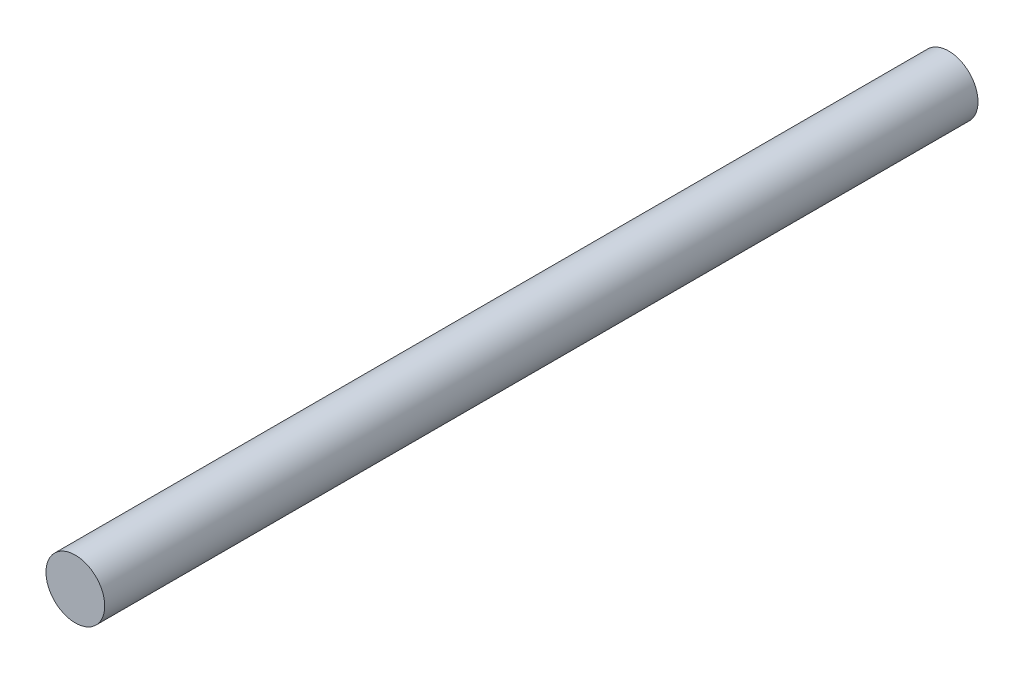
ISO-10303-21;
HEADER;
FILE_DESCRIPTION(('STEP AP214'),'2;1');
FILE_NAME('part.step','',(''),(''),'','','');
FILE_SCHEMA(('AUTOMOTIVE_DESIGN { 1 0 10303 214 1 1 1 1 }'));
ENDSEC;
DATA;
#1=APPLICATION_CONTEXT('core data for automotive mechanical design processes');
#2=APPLICATION_PROTOCOL_DEFINITION('international standard','automotive_design',2000,#1);
#3=PRODUCT_CONTEXT('',#1,'mechanical');
#4=PRODUCT('Part','Part','',(#3));
#5=PRODUCT_RELATED_PRODUCT_CATEGORY('part','',(#4));
#6=PRODUCT_DEFINITION_FORMATION('','',#4);
#7=PRODUCT_DEFINITION_CONTEXT('part definition',#1,'design');
#8=PRODUCT_DEFINITION('design','',#6,#7);
#9=PRODUCT_DEFINITION_SHAPE('','',#8);
#10=(LENGTH_UNIT() NAMED_UNIT(*) SI_UNIT(.MILLI.,.METRE.));
#11=(NAMED_UNIT(*) PLANE_ANGLE_UNIT() SI_UNIT($,.RADIAN.));
#12=(NAMED_UNIT(*) SI_UNIT($,.STERADIAN.) SOLID_ANGLE_UNIT());
#13=UNCERTAINTY_MEASURE_WITH_UNIT(LENGTH_MEASURE(1.E-05),#10,'distance_accuracy_value','');
#14=(GEOMETRIC_REPRESENTATION_CONTEXT(3) GLOBAL_UNCERTAINTY_ASSIGNED_CONTEXT((#13)) GLOBAL_UNIT_ASSIGNED_CONTEXT((#10,
#11,#12)) REPRESENTATION_CONTEXT('',''));
#15=CARTESIAN_POINT('',(0.,0.,0.));
#16=DIRECTION('',(0.,0.,1.));
#17=DIRECTION('',(1.,0.,0.));
#18=AXIS2_PLACEMENT_3D('',#15,#16,#17);
#19=CARTESIAN_POINT('',(0.,0.,74.25));
#20=DIRECTION('',(0.,0.,-1.));
#21=DIRECTION('',(-1.,0.,0.));
#22=AXIS2_PLACEMENT_3D('',#19,#20,#21);
#23=CYLINDRICAL_SURFACE('',#22,5.);
#24=CARTESIAN_POINT('',(0.,0.,74.25));
#25=DIRECTION('',(0.,0.,1.));
#26=DIRECTION('',(1.,0.,0.));
#27=AXIS2_PLACEMENT_3D('',#24,#25,#26);
#28=CIRCLE('',#27,5.);
#29=CARTESIAN_POINT('',(5.,0.,74.25));
#30=VERTEX_POINT('',#29);
#31=EDGE_CURVE('E10',#30,#30,#28,.T.);
#32=ORIENTED_EDGE('',*,*,#31,.F.);
#33=EDGE_LOOP('',(#32));
#34=FACE_BOUND('',#33,.T.);
#35=CARTESIAN_POINT('',(0.,0.,-74.25));
#36=DIRECTION('',(0.,0.,1.));
#37=DIRECTION('',(1.,0.,0.));
#38=AXIS2_PLACEMENT_3D('',#35,#36,#37);
#39=CIRCLE('',#38,5.);
#40=CARTESIAN_POINT('',(5.,0.,-74.25));
#41=VERTEX_POINT('',#40);
#42=EDGE_CURVE('E38',#41,#41,#39,.T.);
#43=ORIENTED_EDGE('',*,*,#42,.T.);
#44=EDGE_LOOP('',(#43));
#45=FACE_BOUND('',#44,.T.);
#46=ADVANCED_FACE('F35',(#34,#45),#23,.T.);
#47=CARTESIAN_POINT('',(0.,0.,74.25));
#48=DIRECTION('',(0.,0.,1.));
#49=DIRECTION('',(1.,0.,0.));
#50=AXIS2_PLACEMENT_3D('',#47,#48,#49);
#51=PLANE('',#50);
#52=ORIENTED_EDGE('',*,*,#31,.T.);
#53=EDGE_LOOP('',(#52));
#54=FACE_BOUND('',#53,.T.);
#55=ADVANCED_FACE('F50',(#54),#51,.T.);
#56=CARTESIAN_POINT('',(0.,0.,-74.25));
#57=DIRECTION('',(0.,0.,1.));
#58=DIRECTION('',(1.,0.,0.));
#59=AXIS2_PLACEMENT_3D('',#56,#57,#58);
#60=PLANE('',#59);
#61=ORIENTED_EDGE('',*,*,#42,.F.);
#62=EDGE_LOOP('',(#61));
#63=FACE_BOUND('',#62,.T.);
#64=ADVANCED_FACE('F48',(#63),#60,.F.);
#65=CLOSED_SHELL('',(#46,#55,#64));
#66=MANIFOLD_SOLID_BREP('B2',#65);
#67=ADVANCED_BREP_SHAPE_REPRESENTATION('',(#18,#66),#14);
#68=SHAPE_DEFINITION_REPRESENTATION(#9,#67);
ENDSEC;
END-ISO-10303-21;
